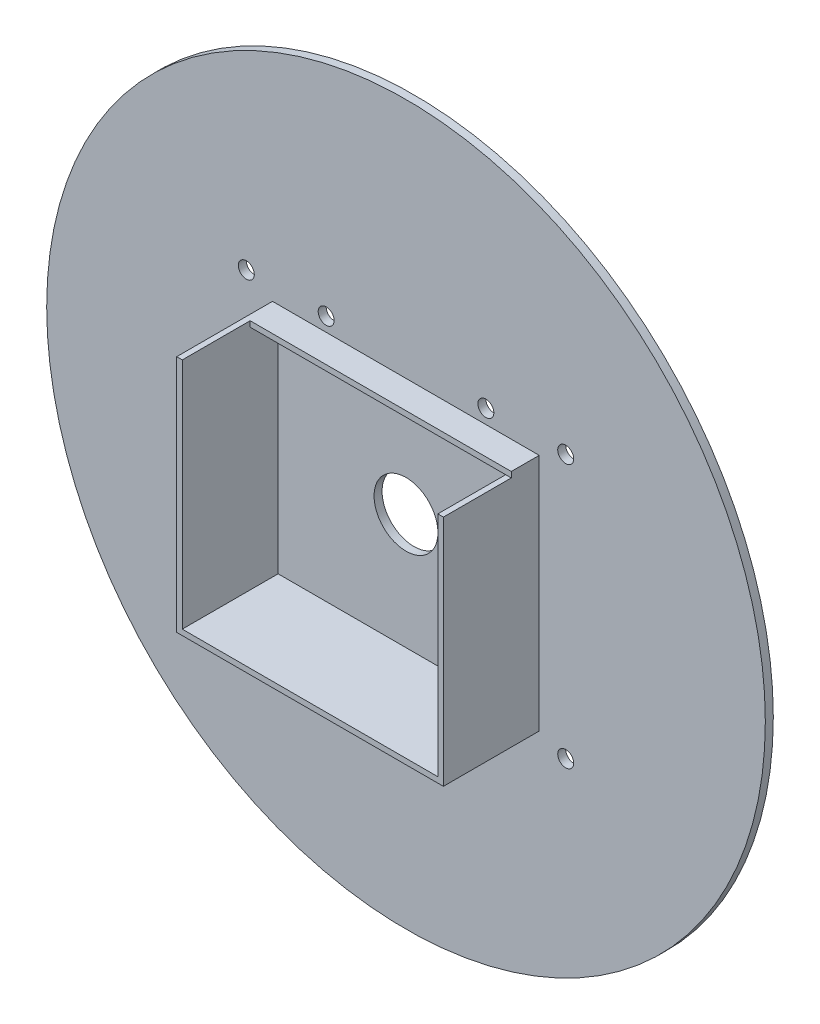
ISO-10303-21;
HEADER;
FILE_DESCRIPTION(('STEP AP214'),'2;1');
FILE_NAME('part.step','',(''),(''),'','','');
FILE_SCHEMA(('AUTOMOTIVE_DESIGN { 1 0 10303 214 1 1 1 1 }'));
ENDSEC;
DATA;
#1=APPLICATION_CONTEXT('core data for automotive mechanical design processes');
#2=APPLICATION_PROTOCOL_DEFINITION('international standard','automotive_design',2000,#1);
#3=PRODUCT_CONTEXT('',#1,'mechanical');
#4=PRODUCT('Part','Part','',(#3));
#5=PRODUCT_RELATED_PRODUCT_CATEGORY('part','',(#4));
#6=PRODUCT_DEFINITION_FORMATION('','',#4);
#7=PRODUCT_DEFINITION_CONTEXT('part definition',#1,'design');
#8=PRODUCT_DEFINITION('design','',#6,#7);
#9=PRODUCT_DEFINITION_SHAPE('','',#8);
#10=(LENGTH_UNIT() NAMED_UNIT(*) SI_UNIT(.MILLI.,.METRE.));
#11=(NAMED_UNIT(*) PLANE_ANGLE_UNIT() SI_UNIT($,.RADIAN.));
#12=(NAMED_UNIT(*) SI_UNIT($,.STERADIAN.) SOLID_ANGLE_UNIT());
#13=UNCERTAINTY_MEASURE_WITH_UNIT(LENGTH_MEASURE(1.E-05),#10,'distance_accuracy_value','');
#14=(GEOMETRIC_REPRESENTATION_CONTEXT(3) GLOBAL_UNCERTAINTY_ASSIGNED_CONTEXT((#13)) GLOBAL_UNIT_ASSIGNED_CONTEXT((#10,
#11,#12)) REPRESENTATION_CONTEXT('',''));
#15=CARTESIAN_POINT('',(0.,0.,0.));
#16=DIRECTION('',(0.,0.,1.));
#17=DIRECTION('',(1.,0.,0.));
#18=AXIS2_PLACEMENT_3D('',#15,#16,#17);
#19=CARTESIAN_POINT('',(0.,0.,1.));
#20=DIRECTION('',(0.,0.,1.));
#21=DIRECTION('',(1.,0.,0.));
#22=AXIS2_PLACEMENT_3D('',#19,#20,#21);
#23=PLANE('',#22);
#24=CARTESIAN_POINT('',(0.,0.,1.));
#25=DIRECTION('',(0.,0.,1.));
#26=DIRECTION('',(1.,0.,0.));
#27=AXIS2_PLACEMENT_3D('',#24,#25,#26);
#28=CIRCLE('',#27,4.);
#29=CARTESIAN_POINT('',(4.,0.,1.));
#30=VERTEX_POINT('',#29);
#31=EDGE_CURVE('E205',#30,#30,#28,.T.);
#32=ORIENTED_EDGE('',*,*,#31,.F.);
#33=EDGE_LOOP('',(#32));
#34=FACE_BOUND('',#33,.T.);
#35=DIRECTION('',(0.,1.,0.));
#36=VECTOR('',#35,1.);
#37=CARTESIAN_POINT('',(-16.0185611412598,14.7362178063326,1.));
#38=LINE('',#37,#36);
#39=CARTESIAN_POINT('',(-16.0185611412598,-14.4637821936674,1.));
#40=VERTEX_POINT('',#39);
#41=CARTESIAN_POINT('',(-16.0185611412598,14.0362178063326,1.));
#42=VERTEX_POINT('',#41);
#43=EDGE_CURVE('E155',#40,#42,#38,.T.);
#44=ORIENTED_EDGE('',*,*,#43,.F.);
#45=DIRECTION('',(-1.,0.,0.));
#46=VECTOR('',#45,1.);
#47=CARTESIAN_POINT('',(-16.0185611412598,-14.4637821936674,1.));
#48=LINE('',#47,#46);
#49=CARTESIAN_POINT('',(15.9814388587402,-14.4637821936674,1.));
#50=VERTEX_POINT('',#49);
#51=EDGE_CURVE('E135',#50,#40,#48,.T.);
#52=ORIENTED_EDGE('',*,*,#51,.F.);
#53=DIRECTION('',(0.,1.,0.));
#54=VECTOR('',#53,1.);
#55=CARTESIAN_POINT('',(15.9814388587402,-14.4637821936674,1.));
#56=LINE('',#55,#54);
#57=CARTESIAN_POINT('',(15.9814388587402,14.0362178063326,1.));
#58=VERTEX_POINT('',#57);
#59=EDGE_CURVE('E192',#50,#58,#56,.T.);
#60=ORIENTED_EDGE('',*,*,#59,.T.);
#61=DIRECTION('',(-1.,0.,0.));
#62=VECTOR('',#61,1.);
#63=CARTESIAN_POINT('',(0.,14.0362178063326,1.));
#64=LINE('',#63,#62);
#65=EDGE_CURVE('E52',#58,#42,#64,.T.);
#66=ORIENTED_EDGE('',*,*,#65,.T.);
#67=EDGE_LOOP('',(#44,#52,#60,#66));
#68=FACE_BOUND('',#67,.T.);
#69=ADVANCED_FACE('F37',(#34,#68),#23,.T.);
#70=CARTESIAN_POINT('',(0.,0.,1.));
#71=DIRECTION('',(0.,0.,1.));
#72=DIRECTION('',(1.,0.,0.));
#73=AXIS2_PLACEMENT_3D('',#70,#71,#72);
#74=CIRCLE('',#73,45.);
#75=CARTESIAN_POINT('',(45.,0.,1.));
#76=VERTEX_POINT('',#75);
#77=EDGE_CURVE('E11',#76,#76,#74,.T.);
#78=ORIENTED_EDGE('',*,*,#77,.T.);
#79=EDGE_LOOP('',(#78));
#80=FACE_BOUND('',#79,.T.);
#81=CARTESIAN_POINT('',(20.,-16.5,1.));
#82=DIRECTION('',(0.,0.,1.));
#83=DIRECTION('',(1.,0.,0.));
#84=AXIS2_PLACEMENT_3D('',#81,#82,#83);
#85=CIRCLE('',#84,1.);
#86=CARTESIAN_POINT('',(21.,-16.5,1.));
#87=VERTEX_POINT('',#86);
#88=EDGE_CURVE('E233',#87,#87,#85,.T.);
#89=ORIENTED_EDGE('',*,*,#88,.F.);
#90=EDGE_LOOP('',(#89));
#91=FACE_BOUND('',#90,.T.);
#92=CARTESIAN_POINT('',(-9.99999999999999,-16.5,1.));
#93=DIRECTION('',(0.,0.,1.));
#94=DIRECTION('',(1.,0.,0.));
#95=AXIS2_PLACEMENT_3D('',#92,#93,#94);
#96=CIRCLE('',#95,1.);
#97=CARTESIAN_POINT('',(-8.99999999999999,-16.5,1.));
#98=VERTEX_POINT('',#97);
#99=EDGE_CURVE('E209',#98,#98,#96,.T.);
#100=ORIENTED_EDGE('',*,*,#99,.F.);
#101=EDGE_LOOP('',(#100));
#102=FACE_BOUND('',#101,.T.);
#103=CARTESIAN_POINT('',(-10.,16.5,1.));
#104=DIRECTION('',(0.,0.,1.));
#105=DIRECTION('',(1.,0.,0.));
#106=AXIS2_PLACEMENT_3D('',#103,#104,#105);
#107=CIRCLE('',#106,1.);
#108=CARTESIAN_POINT('',(-8.99999999999999,16.5,1.));
#109=VERTEX_POINT('',#108);
#110=EDGE_CURVE('E222',#109,#109,#107,.T.);
#111=ORIENTED_EDGE('',*,*,#110,.F.);
#112=EDGE_LOOP('',(#111));
#113=FACE_BOUND('',#112,.T.);
#114=CARTESIAN_POINT('',(10.,16.5,1.));
#115=DIRECTION('',(0.,0.,1.));
#116=DIRECTION('',(1.,0.,0.));
#117=AXIS2_PLACEMENT_3D('',#114,#115,#116);
#118=CIRCLE('',#117,1.);
#119=CARTESIAN_POINT('',(11.,16.5,1.));
#120=VERTEX_POINT('',#119);
#121=EDGE_CURVE('E216',#120,#120,#118,.T.);
#122=ORIENTED_EDGE('',*,*,#121,.F.);
#123=EDGE_LOOP('',(#122));
#124=FACE_BOUND('',#123,.T.);
#125=CARTESIAN_POINT('',(10.,-16.5,1.));
#126=DIRECTION('',(0.,0.,1.));
#127=DIRECTION('',(1.,0.,0.));
#128=AXIS2_PLACEMENT_3D('',#125,#126,#127);
#129=CIRCLE('',#128,1.);
#130=CARTESIAN_POINT('',(11.,-16.5,1.));
#131=VERTEX_POINT('',#130);
#132=EDGE_CURVE('E215',#131,#131,#129,.T.);
#133=ORIENTED_EDGE('',*,*,#132,.F.);
#134=EDGE_LOOP('',(#133));
#135=FACE_BOUND('',#134,.T.);
#136=CARTESIAN_POINT('',(-20.,-16.5,1.));
#137=DIRECTION('',(0.,0.,1.));
#138=DIRECTION('',(1.,0.,0.));
#139=AXIS2_PLACEMENT_3D('',#136,#137,#138);
#140=CIRCLE('',#139,1.);
#141=CARTESIAN_POINT('',(-19.,-16.5,1.));
#142=VERTEX_POINT('',#141);
#143=EDGE_CURVE('E246',#142,#142,#140,.T.);
#144=ORIENTED_EDGE('',*,*,#143,.F.);
#145=EDGE_LOOP('',(#144));
#146=FACE_BOUND('',#145,.T.);
#147=CARTESIAN_POINT('',(-20.,16.5,1.));
#148=DIRECTION('',(0.,0.,1.));
#149=DIRECTION('',(1.,0.,0.));
#150=AXIS2_PLACEMENT_3D('',#147,#148,#149);
#151=CIRCLE('',#150,1.);
#152=CARTESIAN_POINT('',(-19.,16.5,1.));
#153=VERTEX_POINT('',#152);
#154=EDGE_CURVE('E240',#153,#153,#151,.T.);
#155=ORIENTED_EDGE('',*,*,#154,.F.);
#156=EDGE_LOOP('',(#155));
#157=FACE_BOUND('',#156,.T.);
#158=CARTESIAN_POINT('',(20.,16.5,1.));
#159=DIRECTION('',(0.,0.,1.));
#160=DIRECTION('',(1.,0.,0.));
#161=AXIS2_PLACEMENT_3D('',#158,#159,#160);
#162=CIRCLE('',#161,1.);
#163=CARTESIAN_POINT('',(21.,16.5,1.));
#164=VERTEX_POINT('',#163);
#165=EDGE_CURVE('E234',#164,#164,#162,.T.);
#166=ORIENTED_EDGE('',*,*,#165,.F.);
#167=EDGE_LOOP('',(#166));
#168=FACE_BOUND('',#167,.T.);
#169=DIRECTION('',(0.,-1.,0.));
#170=VECTOR('',#169,1.);
#171=CARTESIAN_POINT('',(-16.7185611412598,-15.1637821936674,1.));
#172=LINE('',#171,#170);
#173=CARTESIAN_POINT('',(-16.7185611412598,14.7362178063326,1.));
#174=VERTEX_POINT('',#173);
#175=CARTESIAN_POINT('',(-16.7185611412598,-15.1637821936674,1.));
#176=VERTEX_POINT('',#175);
#177=EDGE_CURVE('E157',#174,#176,#172,.T.);
#178=ORIENTED_EDGE('',*,*,#177,.F.);
#179=DIRECTION('',(-1.,0.,0.));
#180=VECTOR('',#179,1.);
#181=CARTESIAN_POINT('',(0.,14.7362178063326,1.));
#182=LINE('',#181,#180);
#183=CARTESIAN_POINT('',(16.6814388587402,14.7362178063326,1.));
#184=VERTEX_POINT('',#183);
#185=EDGE_CURVE('E138',#184,#174,#182,.T.);
#186=ORIENTED_EDGE('',*,*,#185,.F.);
#187=DIRECTION('',(0.,1.,0.));
#188=VECTOR('',#187,1.);
#189=CARTESIAN_POINT('',(16.6814388587402,-14.4637821936674,1.));
#190=LINE('',#189,#188);
#191=CARTESIAN_POINT('',(16.6814388587402,-15.1637821936674,1.));
#192=VERTEX_POINT('',#191);
#193=EDGE_CURVE('E188',#192,#184,#190,.T.);
#194=ORIENTED_EDGE('',*,*,#193,.F.);
#195=DIRECTION('',(1.,0.,0.));
#196=VECTOR('',#195,1.);
#197=CARTESIAN_POINT('',(16.6814388587402,-15.1637821936674,1.));
#198=LINE('',#197,#196);
#199=EDGE_CURVE('E129',#176,#192,#198,.T.);
#200=ORIENTED_EDGE('',*,*,#199,.F.);
#201=EDGE_LOOP('',(#178,#186,#194,#200));
#202=FACE_BOUND('',#201,.T.);
#203=ADVANCED_FACE('F262',(#80,#91,#102,#113,#124,#135,#146,#157,#168,#202),#23,.T.);
#204=CARTESIAN_POINT('',(0.,0.,1.));
#205=DIRECTION('',(0.,0.,-1.));
#206=DIRECTION('',(-1.,0.,0.));
#207=AXIS2_PLACEMENT_3D('',#204,#205,#206);
#208=CYLINDRICAL_SURFACE('',#207,45.);
#209=ORIENTED_EDGE('',*,*,#77,.F.);
#210=EDGE_LOOP('',(#209));
#211=FACE_BOUND('',#210,.T.);
#212=CARTESIAN_POINT('',(0.,0.,0.));
#213=DIRECTION('',(0.,0.,1.));
#214=DIRECTION('',(1.,0.,0.));
#215=AXIS2_PLACEMENT_3D('',#212,#213,#214);
#216=CIRCLE('',#215,45.);
#217=CARTESIAN_POINT('',(45.,0.,0.));
#218=VERTEX_POINT('',#217);
#219=EDGE_CURVE('E41',#218,#218,#216,.T.);
#220=ORIENTED_EDGE('',*,*,#219,.T.);
#221=EDGE_LOOP('',(#220));
#222=FACE_BOUND('',#221,.T.);
#223=ADVANCED_FACE('F39',(#211,#222),#208,.T.);
#224=CARTESIAN_POINT('',(0.,0.,0.));
#225=DIRECTION('',(0.,0.,1.));
#226=DIRECTION('',(1.,0.,0.));
#227=AXIS2_PLACEMENT_3D('',#224,#225,#226);
#228=PLANE('',#227);
#229=CARTESIAN_POINT('',(0.,0.,0.));
#230=DIRECTION('',(0.,0.,1.));
#231=DIRECTION('',(1.,0.,0.));
#232=AXIS2_PLACEMENT_3D('',#229,#230,#231);
#233=CIRCLE('',#232,4.);
#234=CARTESIAN_POINT('',(4.,0.,0.));
#235=VERTEX_POINT('',#234);
#236=EDGE_CURVE('E206',#235,#235,#233,.T.);
#237=ORIENTED_EDGE('',*,*,#236,.T.);
#238=EDGE_LOOP('',(#237));
#239=FACE_BOUND('',#238,.T.);
#240=CARTESIAN_POINT('',(20.,16.5,0.));
#241=DIRECTION('',(0.,0.,1.));
#242=DIRECTION('',(1.,0.,0.));
#243=AXIS2_PLACEMENT_3D('',#240,#241,#242);
#244=CIRCLE('',#243,1.);
#245=CARTESIAN_POINT('',(21.,16.5,0.));
#246=VERTEX_POINT('',#245);
#247=EDGE_CURVE('E230',#246,#246,#244,.T.);
#248=ORIENTED_EDGE('',*,*,#247,.T.);
#249=EDGE_LOOP('',(#248));
#250=FACE_BOUND('',#249,.T.);
#251=CARTESIAN_POINT('',(-20.,16.5,0.));
#252=DIRECTION('',(0.,0.,1.));
#253=DIRECTION('',(1.,0.,0.));
#254=AXIS2_PLACEMENT_3D('',#251,#252,#253);
#255=CIRCLE('',#254,1.);
#256=CARTESIAN_POINT('',(-19.,16.5,0.));
#257=VERTEX_POINT('',#256);
#258=EDGE_CURVE('E237',#257,#257,#255,.T.);
#259=ORIENTED_EDGE('',*,*,#258,.T.);
#260=EDGE_LOOP('',(#259));
#261=FACE_BOUND('',#260,.T.);
#262=CARTESIAN_POINT('',(-20.,-16.5,0.));
#263=DIRECTION('',(0.,0.,1.));
#264=DIRECTION('',(1.,0.,0.));
#265=AXIS2_PLACEMENT_3D('',#262,#263,#264);
#266=CIRCLE('',#265,1.);
#267=CARTESIAN_POINT('',(-19.,-16.5,0.));
#268=VERTEX_POINT('',#267);
#269=EDGE_CURVE('E243',#268,#268,#266,.T.);
#270=ORIENTED_EDGE('',*,*,#269,.T.);
#271=EDGE_LOOP('',(#270));
#272=FACE_BOUND('',#271,.T.);
#273=CARTESIAN_POINT('',(10.,-16.5,0.));
#274=DIRECTION('',(0.,0.,1.));
#275=DIRECTION('',(1.,0.,0.));
#276=AXIS2_PLACEMENT_3D('',#273,#274,#275);
#277=CIRCLE('',#276,1.);
#278=CARTESIAN_POINT('',(11.,-16.5,0.));
#279=VERTEX_POINT('',#278);
#280=EDGE_CURVE('E249',#279,#279,#277,.T.);
#281=ORIENTED_EDGE('',*,*,#280,.T.);
#282=EDGE_LOOP('',(#281));
#283=FACE_BOUND('',#282,.T.);
#284=CARTESIAN_POINT('',(10.,16.5,0.));
#285=DIRECTION('',(0.,0.,1.));
#286=DIRECTION('',(1.,0.,0.));
#287=AXIS2_PLACEMENT_3D('',#284,#285,#286);
#288=CIRCLE('',#287,1.);
#289=CARTESIAN_POINT('',(11.,16.5,0.));
#290=VERTEX_POINT('',#289);
#291=EDGE_CURVE('E212',#290,#290,#288,.T.);
#292=ORIENTED_EDGE('',*,*,#291,.T.);
#293=EDGE_LOOP('',(#292));
#294=FACE_BOUND('',#293,.T.);
#295=CARTESIAN_POINT('',(-10.,16.5,0.));
#296=DIRECTION('',(0.,0.,1.));
#297=DIRECTION('',(1.,0.,0.));
#298=AXIS2_PLACEMENT_3D('',#295,#296,#297);
#299=CIRCLE('',#298,1.);
#300=CARTESIAN_POINT('',(-8.99999999999999,16.5,0.));
#301=VERTEX_POINT('',#300);
#302=EDGE_CURVE('E219',#301,#301,#299,.T.);
#303=ORIENTED_EDGE('',*,*,#302,.T.);
#304=EDGE_LOOP('',(#303));
#305=FACE_BOUND('',#304,.T.);
#306=CARTESIAN_POINT('',(-9.99999999999999,-16.5,0.));
#307=DIRECTION('',(0.,0.,1.));
#308=DIRECTION('',(1.,0.,0.));
#309=AXIS2_PLACEMENT_3D('',#306,#307,#308);
#310=CIRCLE('',#309,1.);
#311=CARTESIAN_POINT('',(-8.99999999999999,-16.5,0.));
#312=VERTEX_POINT('',#311);
#313=EDGE_CURVE('E225',#312,#312,#310,.T.);
#314=ORIENTED_EDGE('',*,*,#313,.T.);
#315=EDGE_LOOP('',(#314));
#316=FACE_BOUND('',#315,.T.);
#317=CARTESIAN_POINT('',(20.,-16.5,0.));
#318=DIRECTION('',(0.,0.,1.));
#319=DIRECTION('',(1.,0.,0.));
#320=AXIS2_PLACEMENT_3D('',#317,#318,#319);
#321=CIRCLE('',#320,1.);
#322=CARTESIAN_POINT('',(21.,-16.5,0.));
#323=VERTEX_POINT('',#322);
#324=EDGE_CURVE('E254',#323,#323,#321,.T.);
#325=ORIENTED_EDGE('',*,*,#324,.T.);
#326=EDGE_LOOP('',(#325));
#327=FACE_BOUND('',#326,.T.);
#328=ORIENTED_EDGE('',*,*,#219,.F.);
#329=EDGE_LOOP('',(#328));
#330=FACE_BOUND('',#329,.T.);
#331=ADVANCED_FACE('F326',(#239,#250,#261,#272,#283,#294,#305,#316,#327,#330),#228,.F.);
#332=CARTESIAN_POINT('',(20.,-16.5,0.));
#333=DIRECTION('',(0.,0.,1.));
#334=DIRECTION('',(1.,0.,0.));
#335=AXIS2_PLACEMENT_3D('',#332,#333,#334);
#336=CYLINDRICAL_SURFACE('',#335,1.);
#337=ORIENTED_EDGE('',*,*,#324,.F.);
#338=EDGE_LOOP('',(#337));
#339=FACE_BOUND('',#338,.T.);
#340=ORIENTED_EDGE('',*,*,#88,.T.);
#341=EDGE_LOOP('',(#340));
#342=FACE_BOUND('',#341,.T.);
#343=ADVANCED_FACE('F260',(#339,#342),#336,.F.);
#344=CARTESIAN_POINT('',(-9.99999999999999,-16.5,0.));
#345=DIRECTION('',(0.,0.,1.));
#346=DIRECTION('',(1.,0.,0.));
#347=AXIS2_PLACEMENT_3D('',#344,#345,#346);
#348=CYLINDRICAL_SURFACE('',#347,1.);
#349=ORIENTED_EDGE('',*,*,#313,.F.);
#350=EDGE_LOOP('',(#349));
#351=FACE_BOUND('',#350,.T.);
#352=ORIENTED_EDGE('',*,*,#99,.T.);
#353=EDGE_LOOP('',(#352));
#354=FACE_BOUND('',#353,.T.);
#355=ADVANCED_FACE('F333',(#351,#354),#348,.F.);
#356=CARTESIAN_POINT('',(-10.,16.5,0.));
#357=DIRECTION('',(0.,0.,1.));
#358=DIRECTION('',(1.,0.,0.));
#359=AXIS2_PLACEMENT_3D('',#356,#357,#358);
#360=CYLINDRICAL_SURFACE('',#359,1.);
#361=ORIENTED_EDGE('',*,*,#302,.F.);
#362=EDGE_LOOP('',(#361));
#363=FACE_BOUND('',#362,.T.);
#364=ORIENTED_EDGE('',*,*,#110,.T.);
#365=EDGE_LOOP('',(#364));
#366=FACE_BOUND('',#365,.T.);
#367=ADVANCED_FACE('F360',(#363,#366),#360,.F.);
#368=CARTESIAN_POINT('',(10.,16.5,0.));
#369=DIRECTION('',(0.,0.,1.));
#370=DIRECTION('',(1.,0.,0.));
#371=AXIS2_PLACEMENT_3D('',#368,#369,#370);
#372=CYLINDRICAL_SURFACE('',#371,1.);
#373=ORIENTED_EDGE('',*,*,#291,.F.);
#374=EDGE_LOOP('',(#373));
#375=FACE_BOUND('',#374,.T.);
#376=ORIENTED_EDGE('',*,*,#121,.T.);
#377=EDGE_LOOP('',(#376));
#378=FACE_BOUND('',#377,.T.);
#379=ADVANCED_FACE('F365',(#375,#378),#372,.F.);
#380=CARTESIAN_POINT('',(10.,-16.5,0.));
#381=DIRECTION('',(0.,0.,1.));
#382=DIRECTION('',(1.,0.,0.));
#383=AXIS2_PLACEMENT_3D('',#380,#381,#382);
#384=CYLINDRICAL_SURFACE('',#383,1.);
#385=ORIENTED_EDGE('',*,*,#280,.F.);
#386=EDGE_LOOP('',(#385));
#387=FACE_BOUND('',#386,.T.);
#388=ORIENTED_EDGE('',*,*,#132,.T.);
#389=EDGE_LOOP('',(#388));
#390=FACE_BOUND('',#389,.T.);
#391=ADVANCED_FACE('F381',(#387,#390),#384,.F.);
#392=CARTESIAN_POINT('',(-20.,-16.5,0.));
#393=DIRECTION('',(0.,0.,1.));
#394=DIRECTION('',(1.,0.,0.));
#395=AXIS2_PLACEMENT_3D('',#392,#393,#394);
#396=CYLINDRICAL_SURFACE('',#395,1.);
#397=ORIENTED_EDGE('',*,*,#269,.F.);
#398=EDGE_LOOP('',(#397));
#399=FACE_BOUND('',#398,.T.);
#400=ORIENTED_EDGE('',*,*,#143,.T.);
#401=EDGE_LOOP('',(#400));
#402=FACE_BOUND('',#401,.T.);
#403=ADVANCED_FACE('F378',(#399,#402),#396,.F.);
#404=CARTESIAN_POINT('',(-20.,16.5,0.));
#405=DIRECTION('',(0.,0.,1.));
#406=DIRECTION('',(1.,0.,0.));
#407=AXIS2_PLACEMENT_3D('',#404,#405,#406);
#408=CYLINDRICAL_SURFACE('',#407,1.);
#409=ORIENTED_EDGE('',*,*,#258,.F.);
#410=EDGE_LOOP('',(#409));
#411=FACE_BOUND('',#410,.T.);
#412=ORIENTED_EDGE('',*,*,#154,.T.);
#413=EDGE_LOOP('',(#412));
#414=FACE_BOUND('',#413,.T.);
#415=ADVANCED_FACE('F374',(#411,#414),#408,.F.);
#416=CARTESIAN_POINT('',(20.,16.5,0.));
#417=DIRECTION('',(0.,0.,1.));
#418=DIRECTION('',(1.,0.,0.));
#419=AXIS2_PLACEMENT_3D('',#416,#417,#418);
#420=CYLINDRICAL_SURFACE('',#419,1.);
#421=ORIENTED_EDGE('',*,*,#247,.F.);
#422=EDGE_LOOP('',(#421));
#423=FACE_BOUND('',#422,.T.);
#424=ORIENTED_EDGE('',*,*,#165,.T.);
#425=EDGE_LOOP('',(#424));
#426=FACE_BOUND('',#425,.T.);
#427=ADVANCED_FACE('F370',(#423,#426),#420,.F.);
#428=CARTESIAN_POINT('',(0.,0.,0.));
#429=DIRECTION('',(0.,0.,1.));
#430=DIRECTION('',(1.,0.,0.));
#431=AXIS2_PLACEMENT_3D('',#428,#429,#430);
#432=CYLINDRICAL_SURFACE('',#431,4.);
#433=ORIENTED_EDGE('',*,*,#236,.F.);
#434=EDGE_LOOP('',(#433));
#435=FACE_BOUND('',#434,.T.);
#436=ORIENTED_EDGE('',*,*,#31,.T.);
#437=EDGE_LOOP('',(#436));
#438=FACE_BOUND('',#437,.T.);
#439=ADVANCED_FACE('F373',(#435,#438),#432,.F.);
#440=CARTESIAN_POINT('',(16.6814388587402,-14.4637821936674,13.));
#441=DIRECTION('',(-1.,0.,0.));
#442=DIRECTION('',(0.,-1.,0.));
#443=AXIS2_PLACEMENT_3D('',#440,#441,#442);
#444=PLANE('',#443);
#445=ORIENTED_EDGE('',*,*,#193,.T.);
#446=DIRECTION('',(0.,0.,-1.));
#447=VECTOR('',#446,1.);
#448=CARTESIAN_POINT('',(16.6814388587402,14.7362178063326,4.5));
#449=LINE('',#448,#447);
#450=CARTESIAN_POINT('',(16.6814388587402,14.7362178063326,4.5));
#451=VERTEX_POINT('',#450);
#452=EDGE_CURVE('E181',#451,#184,#449,.T.);
#453=ORIENTED_EDGE('',*,*,#452,.F.);
#454=DIRECTION('',(0.,1.,0.));
#455=VECTOR('',#454,1.);
#456=CARTESIAN_POINT('',(16.6814388587399,-3.30716384015176E-13,4.5));
#457=LINE('',#456,#455);
#458=CARTESIAN_POINT('',(16.6814388587402,14.0362178063326,4.5));
#459=VERTEX_POINT('',#458);
#460=EDGE_CURVE('E179',#459,#451,#457,.T.);
#461=ORIENTED_EDGE('',*,*,#460,.F.);
#462=DIRECTION('',(0.,0.,-1.));
#463=VECTOR('',#462,1.);
#464=CARTESIAN_POINT('',(16.6814388587402,14.0362178063326,13.));
#465=LINE('',#464,#463);
#466=CARTESIAN_POINT('',(16.6814388587402,14.0362178063326,13.));
#467=VERTEX_POINT('',#466);
#468=EDGE_CURVE('E202',#467,#459,#465,.T.);
#469=ORIENTED_EDGE('',*,*,#468,.F.);
#470=DIRECTION('',(0.,1.,0.));
#471=VECTOR('',#470,1.);
#472=CARTESIAN_POINT('',(16.6814388587402,-14.4637821936674,13.));
#473=LINE('',#472,#471);
#474=CARTESIAN_POINT('',(16.6814388587402,-15.1637821936674,13.));
#475=VERTEX_POINT('',#474);
#476=EDGE_CURVE('E189',#475,#467,#473,.T.);
#477=ORIENTED_EDGE('',*,*,#476,.F.);
#478=DIRECTION('',(0.,0.,-1.));
#479=VECTOR('',#478,1.);
#480=CARTESIAN_POINT('',(16.6814388587402,-15.1637821936674,13.));
#481=LINE('',#480,#479);
#482=EDGE_CURVE('E153',#475,#192,#481,.T.);
#483=ORIENTED_EDGE('',*,*,#482,.T.);
#484=EDGE_LOOP('',(#445,#453,#461,#469,#477,#483));
#485=FACE_BOUND('',#484,.T.);
#486=ADVANCED_FACE('F299',(#485),#444,.F.);
#487=CARTESIAN_POINT('',(15.9814388587402,14.0362178063326,13.));
#488=DIRECTION('',(0.,1.,0.));
#489=DIRECTION('',(0.,0.,1.));
#490=AXIS2_PLACEMENT_3D('',#487,#488,#489);
#491=PLANE('',#490);
#492=DIRECTION('',(-1.,0.,0.));
#493=VECTOR('',#492,1.);
#494=CARTESIAN_POINT('',(0.,14.0362178063326,4.5));
#495=LINE('',#494,#493);
#496=CARTESIAN_POINT('',(15.9814388587402,14.0362178063326,4.5));
#497=VERTEX_POINT('',#496);
#498=EDGE_CURVE('E177',#459,#497,#495,.T.);
#499=ORIENTED_EDGE('',*,*,#498,.T.);
#500=DIRECTION('',(0.,0.,-1.));
#501=VECTOR('',#500,1.);
#502=CARTESIAN_POINT('',(15.9814388587402,14.0362178063326,13.));
#503=LINE('',#502,#501);
#504=CARTESIAN_POINT('',(15.9814388587402,14.0362178063326,13.));
#505=VERTEX_POINT('',#504);
#506=EDGE_CURVE('E60',#505,#497,#503,.T.);
#507=ORIENTED_EDGE('',*,*,#506,.F.);
#508=DIRECTION('',(1.,0.,0.));
#509=VECTOR('',#508,1.);
#510=CARTESIAN_POINT('',(15.9814388587402,14.0362178063326,13.));
#511=LINE('',#510,#509);
#512=EDGE_CURVE('E191',#505,#467,#511,.T.);
#513=ORIENTED_EDGE('',*,*,#512,.T.);
#514=ORIENTED_EDGE('',*,*,#468,.T.);
#515=EDGE_LOOP('',(#499,#507,#513,#514));
#516=FACE_BOUND('',#515,.T.);
#517=ADVANCED_FACE('F301',(#516),#491,.T.);
#518=CARTESIAN_POINT('',(15.9814388587402,-14.4637821936674,13.));
#519=DIRECTION('',(-1.,0.,0.));
#520=DIRECTION('',(0.,-1.,0.));
#521=AXIS2_PLACEMENT_3D('',#518,#519,#520);
#522=PLANE('',#521);
#523=ORIENTED_EDGE('',*,*,#59,.F.);
#524=DIRECTION('',(0.,0.,-1.));
#525=VECTOR('',#524,1.);
#526=CARTESIAN_POINT('',(15.9814388587402,-14.4637821936674,13.));
#527=LINE('',#526,#525);
#528=CARTESIAN_POINT('',(15.9814388587402,-14.4637821936674,13.));
#529=VERTEX_POINT('',#528);
#530=EDGE_CURVE('E195',#529,#50,#527,.T.);
#531=ORIENTED_EDGE('',*,*,#530,.F.);
#532=DIRECTION('',(0.,1.,0.));
#533=VECTOR('',#532,1.);
#534=CARTESIAN_POINT('',(15.9814388587402,-14.4637821936674,13.));
#535=LINE('',#534,#533);
#536=EDGE_CURVE('E126',#529,#505,#535,.T.);
#537=ORIENTED_EDGE('',*,*,#536,.T.);
#538=ORIENTED_EDGE('',*,*,#506,.T.);
#539=EDGE_CURVE('E200',#497,#58,#503,.T.);
#540=ORIENTED_EDGE('',*,*,#539,.T.);
#541=EDGE_LOOP('',(#523,#531,#537,#538,#540));
#542=FACE_BOUND('',#541,.T.);
#543=ADVANCED_FACE('F304',(#542),#522,.T.);
#544=CARTESIAN_POINT('',(0.,0.,13.));
#545=DIRECTION('',(0.,0.,-1.));
#546=DIRECTION('',(-1.,0.,0.));
#547=AXIS2_PLACEMENT_3D('',#544,#545,#546);
#548=PLANE('',#547);
#549=ORIENTED_EDGE('',*,*,#476,.T.);
#550=ORIENTED_EDGE('',*,*,#512,.F.);
#551=ORIENTED_EDGE('',*,*,#536,.F.);
#552=DIRECTION('',(-1.,0.,0.));
#553=VECTOR('',#552,1.);
#554=CARTESIAN_POINT('',(15.9814388587402,-14.4637821936674,13.));
#555=LINE('',#554,#553);
#556=CARTESIAN_POINT('',(-16.0185611412598,-14.4637821936674,13.));
#557=VERTEX_POINT('',#556);
#558=EDGE_CURVE('E119',#529,#557,#555,.T.);
#559=ORIENTED_EDGE('',*,*,#558,.T.);
#560=DIRECTION('',(0.,1.,0.));
#561=VECTOR('',#560,1.);
#562=CARTESIAN_POINT('',(-16.0185611412598,14.7362178063326,13.));
#563=LINE('',#562,#561);
#564=CARTESIAN_POINT('',(-16.0185611412598,14.7362178063326,13.));
#565=VERTEX_POINT('',#564);
#566=EDGE_CURVE('E123',#557,#565,#563,.T.);
#567=ORIENTED_EDGE('',*,*,#566,.T.);
#568=DIRECTION('',(-1.,0.,0.));
#569=VECTOR('',#568,1.);
#570=CARTESIAN_POINT('',(-16.7185611412598,14.7362178063326,13.));
#571=LINE('',#570,#569);
#572=CARTESIAN_POINT('',(-16.7185611412598,14.7362178063326,13.));
#573=VERTEX_POINT('',#572);
#574=EDGE_CURVE('E144',#565,#573,#571,.T.);
#575=ORIENTED_EDGE('',*,*,#574,.T.);
#576=DIRECTION('',(0.,-1.,0.));
#577=VECTOR('',#576,1.);
#578=CARTESIAN_POINT('',(-16.7185611412598,-15.1637821936674,13.));
#579=LINE('',#578,#577);
#580=CARTESIAN_POINT('',(-16.7185611412598,-15.1637821936674,13.));
#581=VERTEX_POINT('',#580);
#582=EDGE_CURVE('E146',#573,#581,#579,.T.);
#583=ORIENTED_EDGE('',*,*,#582,.T.);
#584=DIRECTION('',(1.,0.,0.));
#585=VECTOR('',#584,1.);
#586=CARTESIAN_POINT('',(16.6814388587402,-15.1637821936674,13.));
#587=LINE('',#586,#585);
#588=EDGE_CURVE('E150',#581,#475,#587,.T.);
#589=ORIENTED_EDGE('',*,*,#588,.T.);
#590=EDGE_LOOP('',(#549,#550,#551,#559,#567,#575,#583,#589));
#591=FACE_BOUND('',#590,.T.);
#592=ADVANCED_FACE('F121',(#591),#548,.F.);
#593=CARTESIAN_POINT('',(0.,14.7362178063326,4.5));
#594=DIRECTION('',(0.,-1.,0.));
#595=DIRECTION('',(1.,0.,0.));
#596=AXIS2_PLACEMENT_3D('',#593,#594,#595);
#597=PLANE('',#596);
#598=ORIENTED_EDGE('',*,*,#185,.T.);
#599=DIRECTION('',(0.,0.,-1.));
#600=VECTOR('',#599,1.);
#601=CARTESIAN_POINT('',(-16.7185611412598,14.7362178063326,13.));
#602=LINE('',#601,#600);
#603=EDGE_CURVE('E166',#573,#174,#602,.T.);
#604=ORIENTED_EDGE('',*,*,#603,.F.);
#605=ORIENTED_EDGE('',*,*,#574,.F.);
#606=DIRECTION('',(0.,0.,-1.));
#607=VECTOR('',#606,1.);
#608=CARTESIAN_POINT('',(-16.0185611412598,14.7362178063326,13.));
#609=LINE('',#608,#607);
#610=CARTESIAN_POINT('',(-16.0185611412598,14.7362178063326,4.5));
#611=VERTEX_POINT('',#610);
#612=EDGE_CURVE('E139',#565,#611,#609,.T.);
#613=ORIENTED_EDGE('',*,*,#612,.T.);
#614=DIRECTION('',(-1.,0.,0.));
#615=VECTOR('',#614,1.);
#616=CARTESIAN_POINT('',(0.,14.7362178063326,4.5));
#617=LINE('',#616,#615);
#618=EDGE_CURVE('E170',#451,#611,#617,.T.);
#619=ORIENTED_EDGE('',*,*,#618,.F.);
#620=ORIENTED_EDGE('',*,*,#452,.T.);
#621=EDGE_LOOP('',(#598,#604,#605,#613,#619,#620));
#622=FACE_BOUND('',#621,.T.);
#623=ADVANCED_FACE('F295',(#622),#597,.F.);
#624=CARTESIAN_POINT('',(0.,14.0362178063326,4.5));
#625=DIRECTION('',(0.,-1.,0.));
#626=DIRECTION('',(1.,0.,0.));
#627=AXIS2_PLACEMENT_3D('',#624,#625,#626);
#628=PLANE('',#627);
#629=ORIENTED_EDGE('',*,*,#65,.F.);
#630=ORIENTED_EDGE('',*,*,#539,.F.);
#631=CARTESIAN_POINT('',(-16.0185611412598,14.0362178063326,4.5));
#632=VERTEX_POINT('',#631);
#633=EDGE_CURVE('E176',#497,#632,#495,.T.);
#634=ORIENTED_EDGE('',*,*,#633,.T.);
#635=DIRECTION('',(0.,0.,-1.));
#636=VECTOR('',#635,1.);
#637=CARTESIAN_POINT('',(-16.0185611412598,14.0362178063326,4.5));
#638=LINE('',#637,#636);
#639=EDGE_CURVE('E186',#632,#42,#638,.T.);
#640=ORIENTED_EDGE('',*,*,#639,.T.);
#641=EDGE_LOOP('',(#629,#630,#634,#640));
#642=FACE_BOUND('',#641,.T.);
#643=ADVANCED_FACE('F307',(#642),#628,.T.);
#644=CARTESIAN_POINT('',(0.,0.,4.5));
#645=DIRECTION('',(0.,0.,1.));
#646=DIRECTION('',(1.,0.,0.));
#647=AXIS2_PLACEMENT_3D('',#644,#645,#646);
#648=PLANE('',#647);
#649=ORIENTED_EDGE('',*,*,#618,.T.);
#650=DIRECTION('',(0.,-1.,0.));
#651=VECTOR('',#650,1.);
#652=CARTESIAN_POINT('',(-16.0185611412598,0.,4.5));
#653=LINE('',#652,#651);
#654=EDGE_CURVE('E173',#611,#632,#653,.T.);
#655=ORIENTED_EDGE('',*,*,#654,.T.);
#656=ORIENTED_EDGE('',*,*,#633,.F.);
#657=ORIENTED_EDGE('',*,*,#498,.F.);
#658=ORIENTED_EDGE('',*,*,#460,.T.);
#659=EDGE_LOOP('',(#649,#655,#656,#657,#658));
#660=FACE_BOUND('',#659,.T.);
#661=ADVANCED_FACE('F310',(#660),#648,.T.);
#662=CARTESIAN_POINT('',(-16.0185611412598,-14.4637821936674,13.));
#663=DIRECTION('',(0.,-1.,0.));
#664=DIRECTION('',(1.,0.,0.));
#665=AXIS2_PLACEMENT_3D('',#662,#663,#664);
#666=PLANE('',#665);
#667=ORIENTED_EDGE('',*,*,#530,.T.);
#668=ORIENTED_EDGE('',*,*,#51,.T.);
#669=DIRECTION('',(0.,0.,-1.));
#670=VECTOR('',#669,1.);
#671=CARTESIAN_POINT('',(-16.0185611412598,-14.4637821936674,13.));
#672=LINE('',#671,#670);
#673=EDGE_CURVE('E132',#557,#40,#672,.T.);
#674=ORIENTED_EDGE('',*,*,#673,.F.);
#675=ORIENTED_EDGE('',*,*,#558,.F.);
#676=EDGE_LOOP('',(#667,#668,#674,#675));
#677=FACE_BOUND('',#676,.T.);
#678=ADVANCED_FACE('F133',(#677),#666,.F.);
#679=CARTESIAN_POINT('',(-16.0185611412598,14.7362178063326,13.));
#680=DIRECTION('',(-1.,0.,0.));
#681=DIRECTION('',(0.,0.,1.));
#682=AXIS2_PLACEMENT_3D('',#679,#680,#681);
#683=PLANE('',#682);
#684=ORIENTED_EDGE('',*,*,#639,.F.);
#685=ORIENTED_EDGE('',*,*,#654,.F.);
#686=ORIENTED_EDGE('',*,*,#612,.F.);
#687=ORIENTED_EDGE('',*,*,#566,.F.);
#688=ORIENTED_EDGE('',*,*,#673,.T.);
#689=ORIENTED_EDGE('',*,*,#43,.T.);
#690=EDGE_LOOP('',(#684,#685,#686,#687,#688,#689));
#691=FACE_BOUND('',#690,.T.);
#692=ADVANCED_FACE('F141',(#691),#683,.F.);
#693=CARTESIAN_POINT('',(-16.7185611412598,-15.1637821936674,13.));
#694=DIRECTION('',(1.,0.,0.));
#695=DIRECTION('',(0.,1.,0.));
#696=AXIS2_PLACEMENT_3D('',#693,#694,#695);
#697=PLANE('',#696);
#698=ORIENTED_EDGE('',*,*,#177,.T.);
#699=DIRECTION('',(0.,0.,-1.));
#700=VECTOR('',#699,1.);
#701=CARTESIAN_POINT('',(-16.7185611412598,-15.1637821936674,13.));
#702=LINE('',#701,#700);
#703=EDGE_CURVE('E163',#581,#176,#702,.T.);
#704=ORIENTED_EDGE('',*,*,#703,.F.);
#705=ORIENTED_EDGE('',*,*,#582,.F.);
#706=ORIENTED_EDGE('',*,*,#603,.T.);
#707=EDGE_LOOP('',(#698,#704,#705,#706));
#708=FACE_BOUND('',#707,.T.);
#709=ADVANCED_FACE('F286',(#708),#697,.F.);
#710=CARTESIAN_POINT('',(16.6814388587402,-15.1637821936674,13.));
#711=DIRECTION('',(0.,1.,0.));
#712=DIRECTION('',(-1.,0.,0.));
#713=AXIS2_PLACEMENT_3D('',#710,#711,#712);
#714=PLANE('',#713);
#715=ORIENTED_EDGE('',*,*,#199,.T.);
#716=ORIENTED_EDGE('',*,*,#482,.F.);
#717=ORIENTED_EDGE('',*,*,#588,.F.);
#718=ORIENTED_EDGE('',*,*,#703,.T.);
#719=EDGE_LOOP('',(#715,#716,#717,#718));
#720=FACE_BOUND('',#719,.T.);
#721=ADVANCED_FACE('F291',(#720),#714,.F.);
#722=CLOSED_SHELL('',(#69,#203,#223,#331,#343,#355,#367,#379,#391,#403,#415,#427,#439,#486,#517,
#543,#592,#623,#643,#661,#678,#692,#709,#721));
#723=MANIFOLD_SOLID_BREP('B2',#722);
#724=ADVANCED_BREP_SHAPE_REPRESENTATION('',(#18,#723),#14);
#725=SHAPE_DEFINITION_REPRESENTATION(#9,#724);
ENDSEC;
END-ISO-10303-21;
